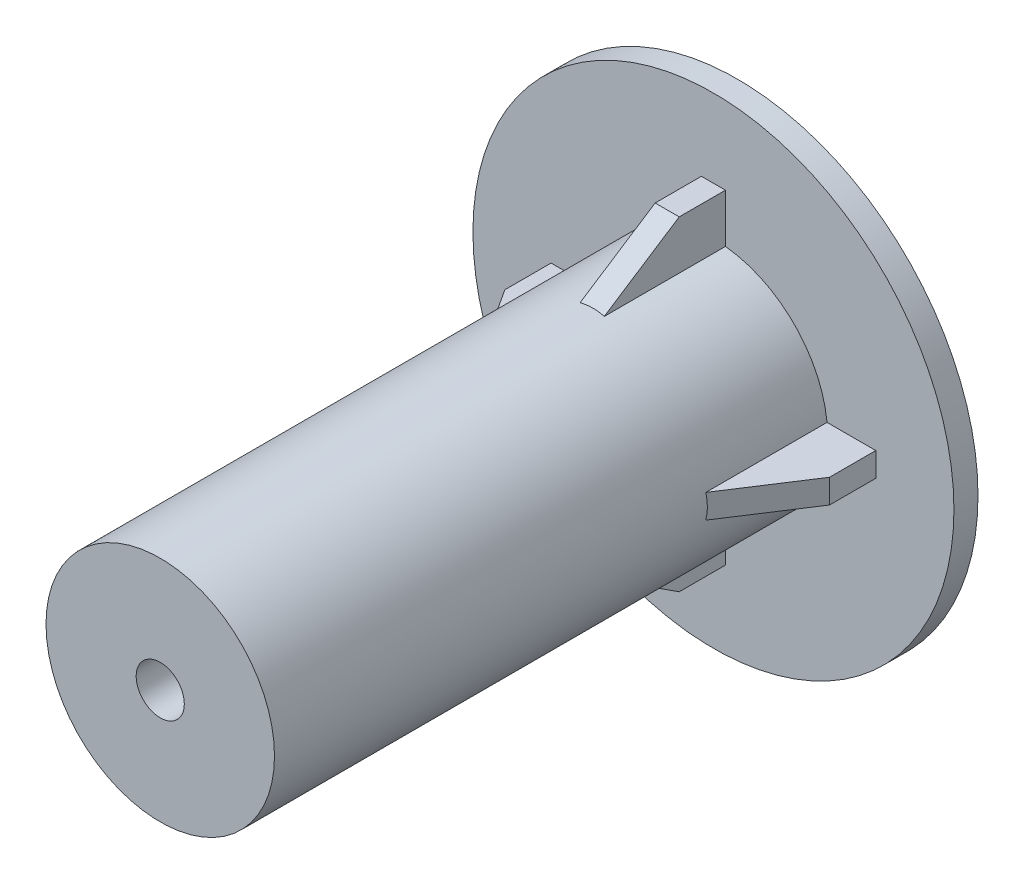
ISO-10303-21;
HEADER;
FILE_DESCRIPTION(('STEP AP214'),'2;1');
FILE_NAME('part.step','',(''),(''),'','','');
FILE_SCHEMA(('AUTOMOTIVE_DESIGN { 1 0 10303 214 1 1 1 1 }'));
ENDSEC;
DATA;
#1=APPLICATION_CONTEXT('core data for automotive mechanical design processes');
#2=APPLICATION_PROTOCOL_DEFINITION('international standard','automotive_design',2000,#1);
#3=PRODUCT_CONTEXT('',#1,'mechanical');
#4=PRODUCT('Part','Part','',(#3));
#5=PRODUCT_RELATED_PRODUCT_CATEGORY('part','',(#4));
#6=PRODUCT_DEFINITION_FORMATION('','',#4);
#7=PRODUCT_DEFINITION_CONTEXT('part definition',#1,'design');
#8=PRODUCT_DEFINITION('design','',#6,#7);
#9=PRODUCT_DEFINITION_SHAPE('','',#8);
#10=(LENGTH_UNIT() NAMED_UNIT(*) SI_UNIT(.MILLI.,.METRE.));
#11=(NAMED_UNIT(*) PLANE_ANGLE_UNIT() SI_UNIT($,.RADIAN.));
#12=(NAMED_UNIT(*) SI_UNIT($,.STERADIAN.) SOLID_ANGLE_UNIT());
#13=UNCERTAINTY_MEASURE_WITH_UNIT(LENGTH_MEASURE(1.E-05),#10,'distance_accuracy_value','');
#14=(GEOMETRIC_REPRESENTATION_CONTEXT(3) GLOBAL_UNCERTAINTY_ASSIGNED_CONTEXT((#13)) GLOBAL_UNIT_ASSIGNED_CONTEXT((#10,
#11,#12)) REPRESENTATION_CONTEXT('',''));
#15=CARTESIAN_POINT('',(0.,0.,0.));
#16=DIRECTION('',(0.,0.,1.));
#17=DIRECTION('',(1.,0.,0.));
#18=AXIS2_PLACEMENT_3D('',#15,#16,#17);
#19=CARTESIAN_POINT('',(0.,0.,230.));
#20=DIRECTION('',(0.,0.,-1.));
#21=DIRECTION('',(-1.,0.,0.));
#22=AXIS2_PLACEMENT_3D('',#19,#20,#21);
#23=CYLINDRICAL_SURFACE('',#22,47.5);
#24=CARTESIAN_POINT('',(0.,0.,123.076923076923));
#25=DIRECTION('',(0.,-0.838443616300637,-0.544988350595414));
#26=DIRECTION('',(0.,0.544988350595414,-0.838443616300637));
#27=AXIS2_PLACEMENT_3D('',#24,#25,#26);
#28=ELLIPSE('',#27,87.1578263060211,47.5);
#29=CARTESIAN_POINT('',(5.00000000000017,47.236109069228,50.4059860473415));
#30=VERTEX_POINT('',#29);
#31=CARTESIAN_POINT('',(-4.99999999999984,47.236109069228,50.4059860473416));
#32=VERTEX_POINT('',#31);
#33=EDGE_CURVE('E226',#30,#32,#28,.F.);
#34=ORIENTED_EDGE('',*,*,#33,.T.);
#35=DIRECTION('',(0.,0.,-1.));
#36=VECTOR('',#35,1.);
#37=CARTESIAN_POINT('',(-4.99999999999984,47.236109069228,230.));
#38=LINE('',#37,#36);
#39=CARTESIAN_POINT('',(-4.99999999999984,47.236109069228,0.));
#40=VERTEX_POINT('',#39);
#41=EDGE_CURVE('E219',#40,#32,#38,.F.);
#42=ORIENTED_EDGE('',*,*,#41,.F.);
#43=CARTESIAN_POINT('',(0.,0.,0.));
#44=DIRECTION('',(0.,0.,-1.));
#45=DIRECTION('',(-1.,0.,0.));
#46=AXIS2_PLACEMENT_3D('',#43,#44,#45);
#47=CIRCLE('',#46,47.5);
#48=CARTESIAN_POINT('',(-47.236109069228,5.,0.));
#49=VERTEX_POINT('',#48);
#50=EDGE_CURVE('E248',#49,#40,#47,.T.);
#51=ORIENTED_EDGE('',*,*,#50,.F.);
#52=DIRECTION('',(0.,0.,-1.));
#53=VECTOR('',#52,1.);
#54=CARTESIAN_POINT('',(-47.236109069228,5.,230.));
#55=LINE('',#54,#53);
#56=CARTESIAN_POINT('',(-47.236109069228,5.,50.4059860473415));
#57=VERTEX_POINT('',#56);
#58=EDGE_CURVE('E237',#49,#57,#55,.F.);
#59=ORIENTED_EDGE('',*,*,#58,.T.);
#60=CARTESIAN_POINT('',(0.,0.,123.076923076923));
#61=DIRECTION('',(0.838443616300637,0.,-0.544988350595414));
#62=DIRECTION('',(-0.544988350595414,0.,-0.838443616300637));
#63=AXIS2_PLACEMENT_3D('',#60,#61,#62);
#64=ELLIPSE('',#63,87.1578263060211,47.5);
#65=CARTESIAN_POINT('',(-47.236109069228,-5.,50.4059860473416));
#66=VERTEX_POINT('',#65);
#67=EDGE_CURVE('E239',#57,#66,#64,.F.);
#68=ORIENTED_EDGE('',*,*,#67,.T.);
#69=DIRECTION('',(0.,0.,-1.));
#70=VECTOR('',#69,1.);
#71=CARTESIAN_POINT('',(-47.236109069228,-5.,230.));
#72=LINE('',#71,#70);
#73=CARTESIAN_POINT('',(-47.236109069228,-5.,0.));
#74=VERTEX_POINT('',#73);
#75=EDGE_CURVE('E232',#74,#66,#72,.F.);
#76=ORIENTED_EDGE('',*,*,#75,.F.);
#77=CARTESIAN_POINT('',(-5.00000000000049,-47.2361090692279,0.));
#78=VERTEX_POINT('',#77);
#79=EDGE_CURVE('E245',#78,#74,#47,.T.);
#80=ORIENTED_EDGE('',*,*,#79,.F.);
#81=DIRECTION('',(0.,0.,-1.));
#82=VECTOR('',#81,1.);
#83=CARTESIAN_POINT('',(-5.00000000000049,-47.2361090692279,230.));
#84=LINE('',#83,#82);
#85=CARTESIAN_POINT('',(-5.0000000000005,-47.236109069228,50.4059860473415));
#86=VERTEX_POINT('',#85);
#87=EDGE_CURVE('E184',#78,#86,#84,.F.);
#88=ORIENTED_EDGE('',*,*,#87,.T.);
#89=CARTESIAN_POINT('',(0.,0.,123.076923076923));
#90=DIRECTION('',(0.,0.838443616300637,-0.544988350595414));
#91=DIRECTION('',(0.,-0.544988350595414,-0.838443616300637));
#92=AXIS2_PLACEMENT_3D('',#89,#90,#91);
#93=ELLIPSE('',#92,87.1578263060211,47.5);
#94=CARTESIAN_POINT('',(4.9999999999995,-47.236109069228,50.4059860473416));
#95=VERTEX_POINT('',#94);
#96=EDGE_CURVE('E196',#86,#95,#93,.F.);
#97=ORIENTED_EDGE('',*,*,#96,.T.);
#98=DIRECTION('',(0.,0.,-1.));
#99=VECTOR('',#98,1.);
#100=CARTESIAN_POINT('',(4.99999999999951,-47.236109069228,230.));
#101=LINE('',#100,#99);
#102=CARTESIAN_POINT('',(4.99999999999951,-47.236109069228,0.));
#103=VERTEX_POINT('',#102);
#104=EDGE_CURVE('E193',#103,#95,#101,.F.);
#105=ORIENTED_EDGE('',*,*,#104,.F.);
#106=CARTESIAN_POINT('',(47.236109069228,-5.,0.));
#107=VERTEX_POINT('',#106);
#108=EDGE_CURVE('E332',#107,#103,#47,.T.);
#109=ORIENTED_EDGE('',*,*,#108,.F.);
#110=DIRECTION('',(0.,0.,-1.));
#111=VECTOR('',#110,1.);
#112=CARTESIAN_POINT('',(47.236109069228,-5.,230.));
#113=LINE('',#112,#111);
#114=CARTESIAN_POINT('',(47.236109069228,-5.,50.4059860473415));
#115=VERTEX_POINT('',#114);
#116=EDGE_CURVE('E206',#107,#115,#113,.F.);
#117=ORIENTED_EDGE('',*,*,#116,.T.);
#118=CARTESIAN_POINT('',(0.,0.,123.076923076923));
#119=DIRECTION('',(-0.838443616300637,0.,-0.544988350595414));
#120=DIRECTION('',(0.544988350595414,0.,-0.838443616300637));
#121=AXIS2_PLACEMENT_3D('',#118,#119,#120);
#122=ELLIPSE('',#121,87.1578263060211,47.5);
#123=CARTESIAN_POINT('',(47.236109069228,5.,50.4059860473416));
#124=VERTEX_POINT('',#123);
#125=EDGE_CURVE('E213',#115,#124,#122,.F.);
#126=ORIENTED_EDGE('',*,*,#125,.T.);
#127=DIRECTION('',(0.,0.,-1.));
#128=VECTOR('',#127,1.);
#129=CARTESIAN_POINT('',(47.236109069228,5.,230.));
#130=LINE('',#129,#128);
#131=CARTESIAN_POINT('',(47.236109069228,5.,0.));
#132=VERTEX_POINT('',#131);
#133=EDGE_CURVE('E210',#132,#124,#130,.F.);
#134=ORIENTED_EDGE('',*,*,#133,.F.);
#135=CARTESIAN_POINT('',(5.00000000000017,47.236109069228,0.));
#136=VERTEX_POINT('',#135);
#137=EDGE_CURVE('E252',#136,#132,#47,.T.);
#138=ORIENTED_EDGE('',*,*,#137,.F.);
#139=DIRECTION('',(0.,0.,-1.));
#140=VECTOR('',#139,1.);
#141=CARTESIAN_POINT('',(5.00000000000017,47.236109069228,230.));
#142=LINE('',#141,#140);
#143=EDGE_CURVE('E224',#136,#30,#142,.F.);
#144=ORIENTED_EDGE('',*,*,#143,.T.);
#145=EDGE_LOOP('',(#34,#42,#51,#59,#68,#76,#80,#88,#97,#105,#109,#117,#126,#134,#138,#144));
#146=FACE_BOUND('',#145,.T.);
#147=CARTESIAN_POINT('',(0.,0.,230.));
#148=DIRECTION('',(0.,0.,1.));
#149=DIRECTION('',(1.,0.,0.));
#150=AXIS2_PLACEMENT_3D('',#147,#148,#149);
#151=CIRCLE('',#150,47.5);
#152=CARTESIAN_POINT('',(47.5,0.,230.));
#153=VERTEX_POINT('',#152);
#154=EDGE_CURVE('E256',#153,#153,#151,.T.);
#155=ORIENTED_EDGE('',*,*,#154,.F.);
#156=EDGE_LOOP('',(#155));
#157=FACE_BOUND('',#156,.T.);
#158=ADVANCED_FACE('F47',(#146,#157),#23,.T.);
#159=CARTESIAN_POINT('',(0.,0.,230.));
#160=DIRECTION('',(0.,0.,1.));
#161=DIRECTION('',(1.,0.,0.));
#162=AXIS2_PLACEMENT_3D('',#159,#160,#161);
#163=PLANE('',#162);
#164=CARTESIAN_POINT('',(0.,0.,230.));
#165=DIRECTION('',(0.,0.,1.));
#166=DIRECTION('',(1.,0.,0.));
#167=AXIS2_PLACEMENT_3D('',#164,#165,#166);
#168=CIRCLE('',#167,10.);
#169=CARTESIAN_POINT('',(10.,0.,230.));
#170=VERTEX_POINT('',#169);
#171=EDGE_CURVE('E251',#170,#170,#168,.T.);
#172=ORIENTED_EDGE('',*,*,#171,.F.);
#173=EDGE_LOOP('',(#172));
#174=FACE_BOUND('',#173,.T.);
#175=ORIENTED_EDGE('',*,*,#154,.T.);
#176=EDGE_LOOP('',(#175));
#177=FACE_BOUND('',#176,.T.);
#178=ADVANCED_FACE('F356',(#174,#177),#163,.T.);
#179=CARTESIAN_POINT('',(0.,0.,210.));
#180=DIRECTION('',(0.,0.,1.));
#181=DIRECTION('',(1.,0.,0.));
#182=AXIS2_PLACEMENT_3D('',#179,#180,#181);
#183=CYLINDRICAL_SURFACE('',#182,10.);
#184=CARTESIAN_POINT('',(0.,0.,210.));
#185=DIRECTION('',(0.,0.,1.));
#186=DIRECTION('',(1.,0.,0.));
#187=AXIS2_PLACEMENT_3D('',#184,#185,#186);
#188=CIRCLE('',#187,10.);
#189=CARTESIAN_POINT('',(10.,0.,210.));
#190=VERTEX_POINT('',#189);
#191=EDGE_CURVE('E253',#190,#190,#188,.T.);
#192=ORIENTED_EDGE('',*,*,#191,.F.);
#193=EDGE_LOOP('',(#192));
#194=FACE_BOUND('',#193,.T.);
#195=ORIENTED_EDGE('',*,*,#171,.T.);
#196=EDGE_LOOP('',(#195));
#197=FACE_BOUND('',#196,.T.);
#198=ADVANCED_FACE('F360',(#194,#197),#183,.F.);
#199=CARTESIAN_POINT('',(0.,0.,210.));
#200=DIRECTION('',(0.,0.,1.));
#201=DIRECTION('',(1.,0.,0.));
#202=AXIS2_PLACEMENT_3D('',#199,#200,#201);
#203=PLANE('',#202);
#204=ORIENTED_EDGE('',*,*,#191,.T.);
#205=EDGE_LOOP('',(#204));
#206=FACE_BOUND('',#205,.T.);
#207=ADVANCED_FACE('F365',(#206),#203,.T.);
#208=CARTESIAN_POINT('',(0.,0.,-10.));
#209=DIRECTION('',(0.,0.,1.));
#210=DIRECTION('',(1.,0.,0.));
#211=AXIS2_PLACEMENT_3D('',#208,#209,#210);
#212=CYLINDRICAL_SURFACE('',#211,100.);
#213=CARTESIAN_POINT('',(0.,0.,-10.));
#214=DIRECTION('',(0.,0.,-1.));
#215=DIRECTION('',(-1.,0.,0.));
#216=AXIS2_PLACEMENT_3D('',#213,#214,#215);
#217=CIRCLE('',#216,100.);
#218=CARTESIAN_POINT('',(-100.,0.,-10.));
#219=VERTEX_POINT('',#218);
#220=EDGE_CURVE('E242',#219,#219,#217,.T.);
#221=ORIENTED_EDGE('',*,*,#220,.F.);
#222=EDGE_LOOP('',(#221));
#223=FACE_BOUND('',#222,.T.);
#224=CARTESIAN_POINT('',(0.,0.,0.));
#225=DIRECTION('',(0.,0.,-1.));
#226=DIRECTION('',(-1.,0.,0.));
#227=AXIS2_PLACEMENT_3D('',#224,#225,#226);
#228=CIRCLE('',#227,100.);
#229=CARTESIAN_POINT('',(-100.,0.,0.));
#230=VERTEX_POINT('',#229);
#231=EDGE_CURVE('E241',#230,#230,#228,.T.);
#232=ORIENTED_EDGE('',*,*,#231,.T.);
#233=EDGE_LOOP('',(#232));
#234=FACE_BOUND('',#233,.T.);
#235=ADVANCED_FACE('F373',(#223,#234),#212,.T.);
#236=CARTESIAN_POINT('',(0.,0.,-10.));
#237=DIRECTION('',(0.,0.,-1.));
#238=DIRECTION('',(-1.,0.,0.));
#239=AXIS2_PLACEMENT_3D('',#236,#237,#238);
#240=PLANE('',#239);
#241=ORIENTED_EDGE('',*,*,#220,.T.);
#242=EDGE_LOOP('',(#241));
#243=FACE_BOUND('',#242,.T.);
#244=ADVANCED_FACE('F377',(#243),#240,.T.);
#245=CARTESIAN_POINT('',(0.,0.,0.));
#246=DIRECTION('',(0.,0.,-1.));
#247=DIRECTION('',(-1.,0.,0.));
#248=AXIS2_PLACEMENT_3D('',#245,#246,#247);
#249=PLANE('',#248);
#250=DIRECTION('',(0.,1.,0.));
#251=VECTOR('',#250,1.);
#252=CARTESIAN_POINT('',(67.5,-67.5,0.));
#253=LINE('',#252,#251);
#254=CARTESIAN_POINT('',(67.5,-5.,0.));
#255=VERTEX_POINT('',#254);
#256=CARTESIAN_POINT('',(67.5,5.,0.));
#257=VERTEX_POINT('',#256);
#258=EDGE_CURVE('E552',#255,#257,#253,.T.);
#259=ORIENTED_EDGE('',*,*,#258,.F.);
#260=DIRECTION('',(-1.,0.,0.));
#261=VECTOR('',#260,1.);
#262=CARTESIAN_POINT('',(0.,-5.,0.));
#263=LINE('',#262,#261);
#264=EDGE_CURVE('E202',#255,#107,#263,.T.);
#265=ORIENTED_EDGE('',*,*,#264,.T.);
#266=ORIENTED_EDGE('',*,*,#108,.T.);
#267=DIRECTION('',(0.,1.,0.));
#268=VECTOR('',#267,1.);
#269=CARTESIAN_POINT('',(5.,0.,0.));
#270=LINE('',#269,#268);
#271=CARTESIAN_POINT('',(4.9999999999993,-67.5,0.));
#272=VERTEX_POINT('',#271);
#273=EDGE_CURVE('E180',#272,#103,#270,.T.);
#274=ORIENTED_EDGE('',*,*,#273,.F.);
#275=DIRECTION('',(1.,0.,0.));
#276=VECTOR('',#275,1.);
#277=CARTESIAN_POINT('',(-67.5,-67.5,0.));
#278=LINE('',#277,#276);
#279=CARTESIAN_POINT('',(-5.00000000000071,-67.5,0.));
#280=VERTEX_POINT('',#279);
#281=EDGE_CURVE('E160',#280,#272,#278,.T.);
#282=ORIENTED_EDGE('',*,*,#281,.F.);
#283=DIRECTION('',(0.,1.,0.));
#284=VECTOR('',#283,1.);
#285=CARTESIAN_POINT('',(-5.,0.,0.));
#286=LINE('',#285,#284);
#287=EDGE_CURVE('E177',#280,#78,#286,.T.);
#288=ORIENTED_EDGE('',*,*,#287,.T.);
#289=ORIENTED_EDGE('',*,*,#79,.T.);
#290=DIRECTION('',(1.,0.,0.));
#291=VECTOR('',#290,1.);
#292=CARTESIAN_POINT('',(0.,-5.,0.));
#293=LINE('',#292,#291);
#294=CARTESIAN_POINT('',(-67.5,-5.,0.));
#295=VERTEX_POINT('',#294);
#296=EDGE_CURVE('E261',#295,#74,#293,.T.);
#297=ORIENTED_EDGE('',*,*,#296,.F.);
#298=DIRECTION('',(0.,-1.,0.));
#299=VECTOR('',#298,1.);
#300=CARTESIAN_POINT('',(-67.5,-67.5,0.));
#301=LINE('',#300,#299);
#302=CARTESIAN_POINT('',(-67.5,5.,0.));
#303=VERTEX_POINT('',#302);
#304=EDGE_CURVE('E61',#303,#295,#301,.T.);
#305=ORIENTED_EDGE('',*,*,#304,.F.);
#306=DIRECTION('',(1.,0.,0.));
#307=VECTOR('',#306,1.);
#308=CARTESIAN_POINT('',(0.,5.,0.));
#309=LINE('',#308,#307);
#310=EDGE_CURVE('E263',#303,#49,#309,.T.);
#311=ORIENTED_EDGE('',*,*,#310,.T.);
#312=ORIENTED_EDGE('',*,*,#50,.T.);
#313=DIRECTION('',(0.,-1.,0.));
#314=VECTOR('',#313,1.);
#315=CARTESIAN_POINT('',(-5.,0.,0.));
#316=LINE('',#315,#314);
#317=CARTESIAN_POINT('',(-4.99999999999976,67.5,0.));
#318=VERTEX_POINT('',#317);
#319=EDGE_CURVE('E265',#318,#40,#316,.T.);
#320=ORIENTED_EDGE('',*,*,#319,.F.);
#321=DIRECTION('',(-1.,0.,0.));
#322=VECTOR('',#321,1.);
#323=CARTESIAN_POINT('',(-67.5,67.5,0.));
#324=LINE('',#323,#322);
#325=CARTESIAN_POINT('',(5.00000000000024,67.5,0.));
#326=VERTEX_POINT('',#325);
#327=EDGE_CURVE('E68',#326,#318,#324,.T.);
#328=ORIENTED_EDGE('',*,*,#327,.F.);
#329=DIRECTION('',(0.,-1.,0.));
#330=VECTOR('',#329,1.);
#331=CARTESIAN_POINT('',(5.,0.,0.));
#332=LINE('',#331,#330);
#333=EDGE_CURVE('E169',#326,#136,#332,.T.);
#334=ORIENTED_EDGE('',*,*,#333,.T.);
#335=ORIENTED_EDGE('',*,*,#137,.T.);
#336=DIRECTION('',(-1.,0.,0.));
#337=VECTOR('',#336,1.);
#338=CARTESIAN_POINT('',(0.,5.,0.));
#339=LINE('',#338,#337);
#340=EDGE_CURVE('E208',#257,#132,#339,.T.);
#341=ORIENTED_EDGE('',*,*,#340,.F.);
#342=EDGE_LOOP('',(#259,#265,#266,#274,#282,#288,#289,#297,#305,#311,#312,#320,#328,#334,#335,#341));
#343=FACE_BOUND('',#342,.T.);
#344=ORIENTED_EDGE('',*,*,#231,.F.);
#345=EDGE_LOOP('',(#344));
#346=FACE_BOUND('',#345,.T.);
#347=ADVANCED_FACE('F174',(#343,#346),#249,.F.);
#348=CARTESIAN_POINT('',(-47.5,0.,50.));
#349=DIRECTION('',(0.838443616300637,0.,-0.544988350595414));
#350=DIRECTION('',(-0.544988350595414,0.,-0.838443616300637));
#351=AXIS2_PLACEMENT_3D('',#348,#349,#350);
#352=PLANE('',#351);
#353=DIRECTION('',(0.,-1.,0.));
#354=VECTOR('',#353,1.);
#355=CARTESIAN_POINT('',(-67.5,0.,19.2307692307692));
#356=LINE('',#355,#354);
#357=CARTESIAN_POINT('',(-67.5,-5.,19.2307692307692));
#358=VERTEX_POINT('',#357);
#359=CARTESIAN_POINT('',(-67.5,5.,19.2307692307692));
#360=VERTEX_POINT('',#359);
#361=EDGE_CURVE('E289',#358,#360,#356,.F.);
#362=ORIENTED_EDGE('',*,*,#361,.F.);
#363=DIRECTION('',(-0.544988350595414,0.,-0.838443616300637));
#364=VECTOR('',#363,1.);
#365=CARTESIAN_POINT('',(-47.5,-5.,50.));
#366=LINE('',#365,#364);
#367=EDGE_CURVE('E228',#66,#358,#366,.T.);
#368=ORIENTED_EDGE('',*,*,#367,.F.);
#369=ORIENTED_EDGE('',*,*,#67,.F.);
#370=DIRECTION('',(-0.544988350595414,0.,-0.838443616300637));
#371=VECTOR('',#370,1.);
#372=CARTESIAN_POINT('',(-47.5,5.,50.));
#373=LINE('',#372,#371);
#374=EDGE_CURVE('E229',#57,#360,#373,.T.);
#375=ORIENTED_EDGE('',*,*,#374,.T.);
#376=EDGE_LOOP('',(#362,#368,#369,#375));
#377=FACE_BOUND('',#376,.T.);
#378=ADVANCED_FACE('F341',(#377),#352,.F.);
#379=CARTESIAN_POINT('',(0.,5.,110.));
#380=DIRECTION('',(0.,1.,0.));
#381=DIRECTION('',(0.,0.,1.));
#382=AXIS2_PLACEMENT_3D('',#379,#380,#381);
#383=PLANE('',#382);
#384=DIRECTION('',(0.,0.,-1.));
#385=VECTOR('',#384,1.);
#386=CARTESIAN_POINT('',(-67.5,5.,110.));
#387=LINE('',#386,#385);
#388=EDGE_CURVE('E297',#360,#303,#387,.T.);
#389=ORIENTED_EDGE('',*,*,#388,.F.);
#390=ORIENTED_EDGE('',*,*,#374,.F.);
#391=ORIENTED_EDGE('',*,*,#58,.F.);
#392=ORIENTED_EDGE('',*,*,#310,.F.);
#393=EDGE_LOOP('',(#389,#390,#391,#392));
#394=FACE_BOUND('',#393,.T.);
#395=ADVANCED_FACE('F345',(#394),#383,.T.);
#396=CARTESIAN_POINT('',(0.,-5.,110.));
#397=DIRECTION('',(0.,1.,0.));
#398=DIRECTION('',(0.,0.,1.));
#399=AXIS2_PLACEMENT_3D('',#396,#397,#398);
#400=PLANE('',#399);
#401=ORIENTED_EDGE('',*,*,#367,.T.);
#402=DIRECTION('',(0.,0.,-1.));
#403=VECTOR('',#402,1.);
#404=CARTESIAN_POINT('',(-67.5,-5.,110.));
#405=LINE('',#404,#403);
#406=EDGE_CURVE('E14',#358,#295,#405,.T.);
#407=ORIENTED_EDGE('',*,*,#406,.T.);
#408=ORIENTED_EDGE('',*,*,#296,.T.);
#409=ORIENTED_EDGE('',*,*,#75,.T.);
#410=EDGE_LOOP('',(#401,#407,#408,#409));
#411=FACE_BOUND('',#410,.T.);
#412=ADVANCED_FACE('F338',(#411),#400,.F.);
#413=CARTESIAN_POINT('',(1.65845363595049E-13,47.5,50.));
#414=DIRECTION('',(0.,-0.838443616300637,-0.544988350595414));
#415=DIRECTION('',(0.,0.544988350595414,-0.838443616300637));
#416=AXIS2_PLACEMENT_3D('',#413,#414,#415);
#417=PLANE('',#416);
#418=DIRECTION('',(-1.,0.,0.));
#419=VECTOR('',#418,1.);
#420=CARTESIAN_POINT('',(0.,67.5,19.2307692307692));
#421=LINE('',#420,#419);
#422=CARTESIAN_POINT('',(-4.99999999999976,67.5,19.2307692307693));
#423=VERTEX_POINT('',#422);
#424=CARTESIAN_POINT('',(5.00000000000037,67.5,19.2307692307692));
#425=VERTEX_POINT('',#424);
#426=EDGE_CURVE('E284',#423,#425,#421,.F.);
#427=ORIENTED_EDGE('',*,*,#426,.F.);
#428=DIRECTION('',(0.,0.544988350595414,-0.838443616300637));
#429=VECTOR('',#428,1.);
#430=CARTESIAN_POINT('',(-4.99999999999983,47.5,50.));
#431=LINE('',#430,#429);
#432=EDGE_CURVE('E215',#32,#423,#431,.T.);
#433=ORIENTED_EDGE('',*,*,#432,.F.);
#434=ORIENTED_EDGE('',*,*,#33,.F.);
#435=DIRECTION('',(0.,0.544988350595414,-0.838443616300637));
#436=VECTOR('',#435,1.);
#437=CARTESIAN_POINT('',(5.00000000000017,47.5,50.));
#438=LINE('',#437,#436);
#439=EDGE_CURVE('E216',#30,#425,#438,.T.);
#440=ORIENTED_EDGE('',*,*,#439,.T.);
#441=EDGE_LOOP('',(#427,#433,#434,#440));
#442=FACE_BOUND('',#441,.T.);
#443=ADVANCED_FACE('F282',(#442),#417,.F.);
#444=CARTESIAN_POINT('',(5.,0.,110.));
#445=DIRECTION('',(1.,0.,0.));
#446=DIRECTION('',(0.,1.,0.));
#447=AXIS2_PLACEMENT_3D('',#444,#445,#446);
#448=PLANE('',#447);
#449=DIRECTION('',(0.,0.,-1.));
#450=VECTOR('',#449,1.);
#451=CARTESIAN_POINT('',(5.00000000000024,67.5,110.));
#452=LINE('',#451,#450);
#453=EDGE_CURVE('E286',#425,#326,#452,.T.);
#454=ORIENTED_EDGE('',*,*,#453,.F.);
#455=ORIENTED_EDGE('',*,*,#439,.F.);
#456=ORIENTED_EDGE('',*,*,#143,.F.);
#457=ORIENTED_EDGE('',*,*,#333,.F.);
#458=EDGE_LOOP('',(#454,#455,#456,#457));
#459=FACE_BOUND('',#458,.T.);
#460=ADVANCED_FACE('F418',(#459),#448,.T.);
#461=CARTESIAN_POINT('',(-5.,0.,110.));
#462=DIRECTION('',(1.,0.,0.));
#463=DIRECTION('',(0.,1.,0.));
#464=AXIS2_PLACEMENT_3D('',#461,#462,#463);
#465=PLANE('',#464);
#466=ORIENTED_EDGE('',*,*,#432,.T.);
#467=DIRECTION('',(0.,0.,-1.));
#468=VECTOR('',#467,1.);
#469=CARTESIAN_POINT('',(-4.99999999999976,67.5,110.));
#470=LINE('',#469,#468);
#471=EDGE_CURVE('E54',#423,#318,#470,.T.);
#472=ORIENTED_EDGE('',*,*,#471,.T.);
#473=ORIENTED_EDGE('',*,*,#319,.T.);
#474=ORIENTED_EDGE('',*,*,#41,.T.);
#475=EDGE_LOOP('',(#466,#472,#473,#474));
#476=FACE_BOUND('',#475,.T.);
#477=ADVANCED_FACE('F270',(#476),#465,.F.);
#478=CARTESIAN_POINT('',(47.5,0.,50.));
#479=DIRECTION('',(-0.838443616300637,0.,-0.544988350595414));
#480=DIRECTION('',(0.544988350595414,0.,-0.838443616300637));
#481=AXIS2_PLACEMENT_3D('',#478,#479,#480);
#482=PLANE('',#481);
#483=DIRECTION('',(0.,1.,0.));
#484=VECTOR('',#483,1.);
#485=CARTESIAN_POINT('',(67.5,0.,19.2307692307692));
#486=LINE('',#485,#484);
#487=CARTESIAN_POINT('',(67.5,5.,19.2307692307692));
#488=VERTEX_POINT('',#487);
#489=CARTESIAN_POINT('',(67.5,-5.,19.2307692307692));
#490=VERTEX_POINT('',#489);
#491=EDGE_CURVE('E292',#488,#490,#486,.F.);
#492=ORIENTED_EDGE('',*,*,#491,.F.);
#493=DIRECTION('',(0.544988350595414,0.,-0.838443616300637));
#494=VECTOR('',#493,1.);
#495=CARTESIAN_POINT('',(47.5,5.,50.));
#496=LINE('',#495,#494);
#497=EDGE_CURVE('E198',#124,#488,#496,.T.);
#498=ORIENTED_EDGE('',*,*,#497,.F.);
#499=ORIENTED_EDGE('',*,*,#125,.F.);
#500=DIRECTION('',(0.544988350595414,0.,-0.838443616300637));
#501=VECTOR('',#500,1.);
#502=CARTESIAN_POINT('',(47.5,-5.,50.));
#503=LINE('',#502,#501);
#504=EDGE_CURVE('E199',#115,#490,#503,.T.);
#505=ORIENTED_EDGE('',*,*,#504,.T.);
#506=EDGE_LOOP('',(#492,#498,#499,#505));
#507=FACE_BOUND('',#506,.T.);
#508=ADVANCED_FACE('F323',(#507),#482,.F.);
#509=CARTESIAN_POINT('',(0.,5.,110.));
#510=DIRECTION('',(0.,-1.,0.));
#511=DIRECTION('',(0.,0.,-1.));
#512=AXIS2_PLACEMENT_3D('',#509,#510,#511);
#513=PLANE('',#512);
#514=ORIENTED_EDGE('',*,*,#497,.T.);
#515=DIRECTION('',(0.,0.,-1.));
#516=VECTOR('',#515,1.);
#517=CARTESIAN_POINT('',(67.5,5.,110.));
#518=LINE('',#517,#516);
#519=EDGE_CURVE('E287',#488,#257,#518,.T.);
#520=ORIENTED_EDGE('',*,*,#519,.T.);
#521=ORIENTED_EDGE('',*,*,#340,.T.);
#522=ORIENTED_EDGE('',*,*,#133,.T.);
#523=EDGE_LOOP('',(#514,#520,#521,#522));
#524=FACE_BOUND('',#523,.T.);
#525=ADVANCED_FACE('F328',(#524),#513,.F.);
#526=CARTESIAN_POINT('',(0.,-5.,110.));
#527=DIRECTION('',(0.,-1.,0.));
#528=DIRECTION('',(0.,0.,-1.));
#529=AXIS2_PLACEMENT_3D('',#526,#527,#528);
#530=PLANE('',#529);
#531=DIRECTION('',(0.,0.,-1.));
#532=VECTOR('',#531,1.);
#533=CARTESIAN_POINT('',(67.5,-5.,110.));
#534=LINE('',#533,#532);
#535=EDGE_CURVE('E168',#490,#255,#534,.T.);
#536=ORIENTED_EDGE('',*,*,#535,.F.);
#537=ORIENTED_EDGE('',*,*,#504,.F.);
#538=ORIENTED_EDGE('',*,*,#116,.F.);
#539=ORIENTED_EDGE('',*,*,#264,.F.);
#540=EDGE_LOOP('',(#536,#537,#538,#539));
#541=FACE_BOUND('',#540,.T.);
#542=ADVANCED_FACE('F320',(#541),#530,.T.);
#543=CARTESIAN_POINT('',(-4.97536090785147E-13,-47.5,50.));
#544=DIRECTION('',(0.,0.838443616300637,-0.544988350595414));
#545=DIRECTION('',(0.,-0.544988350595414,-0.838443616300637));
#546=AXIS2_PLACEMENT_3D('',#543,#544,#545);
#547=PLANE('',#546);
#548=DIRECTION('',(1.,0.,0.));
#549=VECTOR('',#548,1.);
#550=CARTESIAN_POINT('',(0.,-67.5,19.2307692307692));
#551=LINE('',#550,#549);
#552=CARTESIAN_POINT('',(4.9999999999995,-67.5,19.2307692307693));
#553=VERTEX_POINT('',#552);
#554=CARTESIAN_POINT('',(-5.00000000000071,-67.5,19.2307692307691));
#555=VERTEX_POINT('',#554);
#556=EDGE_CURVE('E163',#553,#555,#551,.F.);
#557=ORIENTED_EDGE('',*,*,#556,.F.);
#558=DIRECTION('',(0.,-0.544988350595414,-0.838443616300637));
#559=VECTOR('',#558,1.);
#560=CARTESIAN_POINT('',(4.9999999999995,-47.5000000000001,50.));
#561=LINE('',#560,#559);
#562=EDGE_CURVE('E188',#95,#553,#561,.T.);
#563=ORIENTED_EDGE('',*,*,#562,.F.);
#564=ORIENTED_EDGE('',*,*,#96,.F.);
#565=DIRECTION('',(0.,-0.544988350595414,-0.838443616300637));
#566=VECTOR('',#565,1.);
#567=CARTESIAN_POINT('',(-5.0000000000005,-47.5,50.));
#568=LINE('',#567,#566);
#569=EDGE_CURVE('E185',#86,#555,#568,.T.);
#570=ORIENTED_EDGE('',*,*,#569,.T.);
#571=EDGE_LOOP('',(#557,#563,#564,#570));
#572=FACE_BOUND('',#571,.T.);
#573=ADVANCED_FACE('F307',(#572),#547,.F.);
#574=CARTESIAN_POINT('',(5.,0.,110.));
#575=DIRECTION('',(-1.,0.,0.));
#576=DIRECTION('',(0.,-1.,0.));
#577=AXIS2_PLACEMENT_3D('',#574,#575,#576);
#578=PLANE('',#577);
#579=ORIENTED_EDGE('',*,*,#562,.T.);
#580=DIRECTION('',(0.,0.,-1.));
#581=VECTOR('',#580,1.);
#582=CARTESIAN_POINT('',(4.99999999999929,-67.5,110.));
#583=LINE('',#582,#581);
#584=EDGE_CURVE('E303',#553,#272,#583,.T.);
#585=ORIENTED_EDGE('',*,*,#584,.T.);
#586=ORIENTED_EDGE('',*,*,#273,.T.);
#587=ORIENTED_EDGE('',*,*,#104,.T.);
#588=EDGE_LOOP('',(#579,#585,#586,#587));
#589=FACE_BOUND('',#588,.T.);
#590=ADVANCED_FACE('F302',(#589),#578,.F.);
#591=CARTESIAN_POINT('',(-5.,0.,110.));
#592=DIRECTION('',(-1.,0.,0.));
#593=DIRECTION('',(0.,-1.,0.));
#594=AXIS2_PLACEMENT_3D('',#591,#592,#593);
#595=PLANE('',#594);
#596=DIRECTION('',(0.,0.,-1.));
#597=VECTOR('',#596,1.);
#598=CARTESIAN_POINT('',(-5.00000000000071,-67.5,110.));
#599=LINE('',#598,#597);
#600=EDGE_CURVE('E157',#555,#280,#599,.T.);
#601=ORIENTED_EDGE('',*,*,#600,.F.);
#602=ORIENTED_EDGE('',*,*,#569,.F.);
#603=ORIENTED_EDGE('',*,*,#87,.F.);
#604=ORIENTED_EDGE('',*,*,#287,.F.);
#605=EDGE_LOOP('',(#601,#602,#603,#604));
#606=FACE_BOUND('',#605,.T.);
#607=ADVANCED_FACE('F183',(#606),#595,.T.);
#608=CARTESIAN_POINT('',(-67.5,-67.5,74.));
#609=DIRECTION('',(0.,1.,0.));
#610=DIRECTION('',(0.,0.,1.));
#611=AXIS2_PLACEMENT_3D('',#608,#609,#610);
#612=PLANE('',#611);
#613=ORIENTED_EDGE('',*,*,#556,.T.);
#614=ORIENTED_EDGE('',*,*,#600,.T.);
#615=ORIENTED_EDGE('',*,*,#281,.T.);
#616=ORIENTED_EDGE('',*,*,#584,.F.);
#617=EDGE_LOOP('',(#613,#614,#615,#616));
#618=FACE_BOUND('',#617,.T.);
#619=ADVANCED_FACE('F159',(#618),#612,.F.);
#620=CARTESIAN_POINT('',(67.5,-67.5,74.));
#621=DIRECTION('',(-1.,0.,0.));
#622=DIRECTION('',(0.,0.,1.));
#623=AXIS2_PLACEMENT_3D('',#620,#621,#622);
#624=PLANE('',#623);
#625=ORIENTED_EDGE('',*,*,#491,.T.);
#626=ORIENTED_EDGE('',*,*,#535,.T.);
#627=ORIENTED_EDGE('',*,*,#258,.T.);
#628=ORIENTED_EDGE('',*,*,#519,.F.);
#629=EDGE_LOOP('',(#625,#626,#627,#628));
#630=FACE_BOUND('',#629,.T.);
#631=ADVANCED_FACE('F314',(#630),#624,.F.);
#632=CARTESIAN_POINT('',(-67.5,67.5,74.));
#633=DIRECTION('',(0.,-1.,0.));
#634=DIRECTION('',(0.,0.,-1.));
#635=AXIS2_PLACEMENT_3D('',#632,#633,#634);
#636=PLANE('',#635);
#637=ORIENTED_EDGE('',*,*,#453,.T.);
#638=ORIENTED_EDGE('',*,*,#327,.T.);
#639=ORIENTED_EDGE('',*,*,#471,.F.);
#640=ORIENTED_EDGE('',*,*,#426,.T.);
#641=EDGE_LOOP('',(#637,#638,#639,#640));
#642=FACE_BOUND('',#641,.T.);
#643=ADVANCED_FACE('F499',(#642),#636,.F.);
#644=CARTESIAN_POINT('',(-67.5,-67.5,74.));
#645=DIRECTION('',(1.,0.,0.));
#646=DIRECTION('',(0.,0.,-1.));
#647=AXIS2_PLACEMENT_3D('',#644,#645,#646);
#648=PLANE('',#647);
#649=ORIENTED_EDGE('',*,*,#388,.T.);
#650=ORIENTED_EDGE('',*,*,#304,.T.);
#651=ORIENTED_EDGE('',*,*,#406,.F.);
#652=ORIENTED_EDGE('',*,*,#361,.T.);
#653=EDGE_LOOP('',(#649,#650,#651,#652));
#654=FACE_BOUND('',#653,.T.);
#655=ADVANCED_FACE('F343',(#654),#648,.F.);
#656=CLOSED_SHELL('',(#158,#178,#198,#207,#235,#244,#347,#378,#395,#412,#443,#460,#477,#508,
#525,#542,#573,#590,#607,#619,#631,#643,#655));
#657=MANIFOLD_SOLID_BREP('B2',#656);
#658=ADVANCED_BREP_SHAPE_REPRESENTATION('',(#18,#657),#14);
#659=SHAPE_DEFINITION_REPRESENTATION(#9,#658);
ENDSEC;
END-ISO-10303-21;
